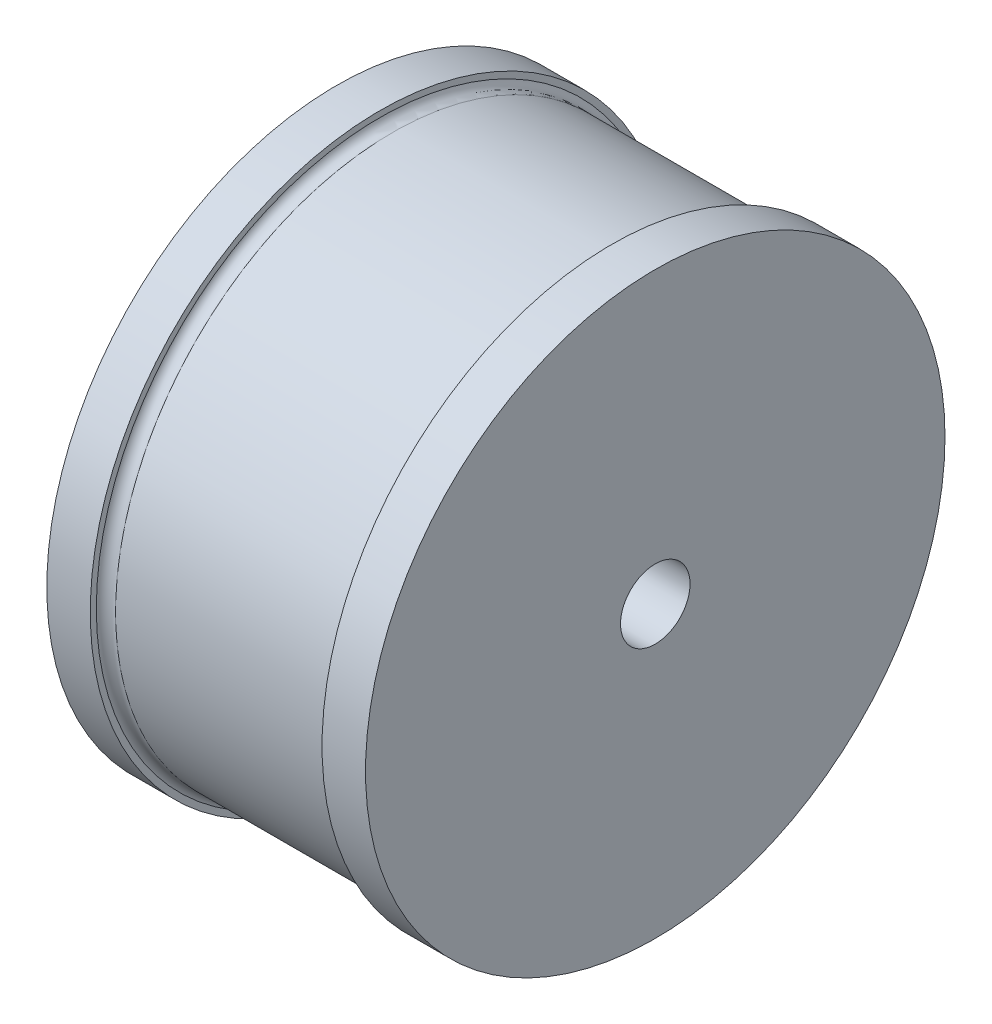
ISO-10303-21;
HEADER;
FILE_DESCRIPTION(('STEP AP214'),'2;1');
FILE_NAME('part.step','',(''),(''),'','','');
FILE_SCHEMA(('AUTOMOTIVE_DESIGN { 1 0 10303 214 1 1 1 1 }'));
ENDSEC;
DATA;
#1=APPLICATION_CONTEXT('core data for automotive mechanical design processes');
#2=APPLICATION_PROTOCOL_DEFINITION('international standard','automotive_design',2000,#1);
#3=PRODUCT_CONTEXT('',#1,'mechanical');
#4=PRODUCT('Part','Part','',(#3));
#5=PRODUCT_RELATED_PRODUCT_CATEGORY('part','',(#4));
#6=PRODUCT_DEFINITION_FORMATION('','',#4);
#7=PRODUCT_DEFINITION_CONTEXT('part definition',#1,'design');
#8=PRODUCT_DEFINITION('design','',#6,#7);
#9=PRODUCT_DEFINITION_SHAPE('','',#8);
#10=(LENGTH_UNIT() NAMED_UNIT(*) SI_UNIT(.MILLI.,.METRE.));
#11=(NAMED_UNIT(*) PLANE_ANGLE_UNIT() SI_UNIT($,.RADIAN.));
#12=(NAMED_UNIT(*) SI_UNIT($,.STERADIAN.) SOLID_ANGLE_UNIT());
#13=UNCERTAINTY_MEASURE_WITH_UNIT(LENGTH_MEASURE(1.E-05),#10,'distance_accuracy_value','');
#14=(GEOMETRIC_REPRESENTATION_CONTEXT(3) GLOBAL_UNCERTAINTY_ASSIGNED_CONTEXT((#13)) GLOBAL_UNIT_ASSIGNED_CONTEXT((#10,
#11,#12)) REPRESENTATION_CONTEXT('',''));
#15=CARTESIAN_POINT('',(0.,0.,0.));
#16=DIRECTION('',(0.,0.,1.));
#17=DIRECTION('',(1.,0.,0.));
#18=AXIS2_PLACEMENT_3D('',#15,#16,#17);
#19=CARTESIAN_POINT('',(23.8765002952672,28.5009217082499,0.));
#20=DIRECTION('',(1.,0.,0.));
#21=DIRECTION('',(0.,0.,-1.));
#22=AXIS2_PLACEMENT_3D('',#19,#20,#21);
#23=PLANE('',#22);
#24=CARTESIAN_POINT('',(23.8765002952672,-21.4990782917501,0.));
#25=DIRECTION('',(1.,0.,0.));
#26=DIRECTION('',(0.,0.,-1.));
#27=AXIS2_PLACEMENT_3D('',#24,#25,#26);
#28=CIRCLE('',#27,6.);
#29=CARTESIAN_POINT('',(23.8765002952672,-21.4990782917501,-6.));
#30=VERTEX_POINT('',#29);
#31=EDGE_CURVE('E66',#30,#30,#28,.T.);
#32=ORIENTED_EDGE('',*,*,#31,.F.);
#33=EDGE_LOOP('',(#32));
#34=FACE_BOUND('',#33,.T.);
#35=CARTESIAN_POINT('',(23.8765002952672,-21.4990782917501,0.));
#36=DIRECTION('',(1.,0.,0.));
#37=DIRECTION('',(0.,0.,-1.));
#38=AXIS2_PLACEMENT_3D('',#35,#36,#37);
#39=CIRCLE('',#38,50.);
#40=CARTESIAN_POINT('',(23.8765002952672,-21.4990782917501,-50.));
#41=VERTEX_POINT('',#40);
#42=EDGE_CURVE('E62',#41,#41,#39,.T.);
#43=ORIENTED_EDGE('',*,*,#42,.T.);
#44=EDGE_LOOP('',(#43));
#45=FACE_BOUND('',#44,.T.);
#46=ADVANCED_FACE('F34',(#34,#45),#23,.T.);
#47=CARTESIAN_POINT('',(-31.1234997047328,20.2265970360911,0.));
#48=DIRECTION('',(-1.,0.,0.));
#49=DIRECTION('',(0.,0.,1.));
#50=AXIS2_PLACEMENT_3D('',#47,#48,#49);
#51=PLANE('',#50);
#52=CARTESIAN_POINT('',(-31.1234997047328,-21.4990782917501,0.));
#53=DIRECTION('',(1.,0.,0.));
#54=DIRECTION('',(0.,0.,-1.));
#55=AXIS2_PLACEMENT_3D('',#52,#53,#54);
#56=CIRCLE('',#55,6.);
#57=CARTESIAN_POINT('',(-31.1234997047328,-21.4990782917501,-6.));
#58=VERTEX_POINT('',#57);
#59=EDGE_CURVE('E65',#58,#58,#56,.T.);
#60=ORIENTED_EDGE('',*,*,#59,.T.);
#61=EDGE_LOOP('',(#60));
#62=FACE_BOUND('',#61,.T.);
#63=CARTESIAN_POINT('',(-31.1234997047328,-21.4990782917501,0.));
#64=DIRECTION('',(1.,0.,0.));
#65=DIRECTION('',(0.,0.,-1.));
#66=AXIS2_PLACEMENT_3D('',#63,#64,#65);
#67=CIRCLE('',#66,50.);
#68=CARTESIAN_POINT('',(-31.1234997047328,-21.4990782917501,-50.));
#69=VERTEX_POINT('',#68);
#70=EDGE_CURVE('E10',#69,#69,#67,.T.);
#71=ORIENTED_EDGE('',*,*,#70,.F.);
#72=EDGE_LOOP('',(#71));
#73=FACE_BOUND('',#72,.T.);
#74=ADVANCED_FACE('F72',(#62,#73),#51,.T.);
#75=CARTESIAN_POINT('',(23.8765002952672,-21.4990782917501,0.));
#76=DIRECTION('',(1.,0.,0.));
#77=DIRECTION('',(0.,0.,-1.));
#78=AXIS2_PLACEMENT_3D('',#75,#76,#77);
#79=CYLINDRICAL_SURFACE('',#78,50.);
#80=ORIENTED_EDGE('',*,*,#70,.T.);
#81=EDGE_LOOP('',(#80));
#82=FACE_BOUND('',#81,.T.);
#83=CARTESIAN_POINT('',(-23.6234997047328,-21.4990782917501,0.));
#84=DIRECTION('',(1.,0.,0.));
#85=DIRECTION('',(0.,0.,-1.));
#86=AXIS2_PLACEMENT_3D('',#83,#84,#85);
#87=CIRCLE('',#86,50.);
#88=CARTESIAN_POINT('',(-23.6234997047328,-21.4990782917501,-50.));
#89=VERTEX_POINT('',#88);
#90=EDGE_CURVE('E40',#89,#89,#87,.T.);
#91=ORIENTED_EDGE('',*,*,#90,.F.);
#92=EDGE_LOOP('',(#91));
#93=FACE_BOUND('',#92,.T.);
#94=ADVANCED_FACE('F111',(#82,#93),#79,.T.);
#95=CARTESIAN_POINT('',(-23.6234997047328,28.5009217082499,0.));
#96=DIRECTION('',(1.,0.,0.));
#97=DIRECTION('',(0.,0.,-1.));
#98=AXIS2_PLACEMENT_3D('',#95,#96,#97);
#99=PLANE('',#98);
#100=ORIENTED_EDGE('',*,*,#90,.T.);
#101=EDGE_LOOP('',(#100));
#102=FACE_BOUND('',#101,.T.);
#103=CARTESIAN_POINT('',(-23.6234997047328,-21.4990782917501,0.));
#104=DIRECTION('',(1.,0.,0.));
#105=DIRECTION('',(0.,0.,-1.));
#106=AXIS2_PLACEMENT_3D('',#103,#104,#105);
#107=CIRCLE('',#106,48.9565128213629);
#108=CARTESIAN_POINT('',(-23.6234997047328,-21.4990782917501,-48.9565128213629));
#109=VERTEX_POINT('',#108);
#110=EDGE_CURVE('E44',#109,#109,#107,.T.);
#111=ORIENTED_EDGE('',*,*,#110,.F.);
#112=EDGE_LOOP('',(#111));
#113=FACE_BOUND('',#112,.T.);
#114=ADVANCED_FACE('F107',(#102,#113),#99,.T.);
#115=CARTESIAN_POINT('',(-21.9644267252277,-21.4990782917501,0.));
#116=DIRECTION('',(1.,0.,0.));
#117=DIRECTION('',(0.,0.,-1.));
#118=AXIS2_PLACEMENT_3D('',#115,#116,#117);
#119=TOROIDAL_SURFACE('',#118,49.4590729795052,1.73351950201775);
#120=ORIENTED_EDGE('',*,*,#110,.T.);
#121=EDGE_LOOP('',(#120));
#122=FACE_BOUND('',#121,.T.);
#123=CARTESIAN_POINT('',(-21.4618665670857,-21.4990782917501,0.));
#124=DIRECTION('',(1.,0.,0.));
#125=DIRECTION('',(0.,0.,-1.));
#126=AXIS2_PLACEMENT_3D('',#123,#124,#125);
#127=CIRCLE('',#126,47.8);
#128=CARTESIAN_POINT('',(-21.4618665670857,-21.4990782917501,-47.8));
#129=VERTEX_POINT('',#128);
#130=EDGE_CURVE('E48',#129,#129,#127,.T.);
#131=ORIENTED_EDGE('',*,*,#130,.F.);
#132=EDGE_LOOP('',(#131));
#133=FACE_BOUND('',#132,.T.);
#134=ADVANCED_FACE('F103',(#122,#133),#119,.F.);
#135=CARTESIAN_POINT('',(23.8765002952672,-21.4990782917501,0.));
#136=DIRECTION('',(1.,0.,0.));
#137=DIRECTION('',(0.,0.,-1.));
#138=AXIS2_PLACEMENT_3D('',#135,#136,#137);
#139=CYLINDRICAL_SURFACE('',#138,47.8);
#140=ORIENTED_EDGE('',*,*,#130,.T.);
#141=EDGE_LOOP('',(#140));
#142=FACE_BOUND('',#141,.T.);
#143=CARTESIAN_POINT('',(14.8143680710811,-21.4990782917501,0.));
#144=DIRECTION('',(1.,0.,0.));
#145=DIRECTION('',(0.,0.,-1.));
#146=AXIS2_PLACEMENT_3D('',#143,#144,#145);
#147=CIRCLE('',#146,47.8);
#148=CARTESIAN_POINT('',(14.8143680710811,-21.4990782917501,-47.8));
#149=VERTEX_POINT('',#148);
#150=EDGE_CURVE('E53',#149,#149,#147,.T.);
#151=ORIENTED_EDGE('',*,*,#150,.F.);
#152=EDGE_LOOP('',(#151));
#153=FACE_BOUND('',#152,.T.);
#154=ADVANCED_FACE('F99',(#142,#153),#139,.T.);
#155=CARTESIAN_POINT('',(14.7658446435271,-21.4990782917501,0.));
#156=DIRECTION('',(1.,0.,0.));
#157=DIRECTION('',(0.,0.,-1.));
#158=AXIS2_PLACEMENT_3D('',#155,#156,#157);
#159=TOROIDAL_SURFACE('',#158,49.4993073521228,1.7);
#160=ORIENTED_EDGE('',*,*,#150,.T.);
#161=EDGE_LOOP('',(#160));
#162=FACE_BOUND('',#161,.T.);
#163=CARTESIAN_POINT('',(16.3765002952672,-21.4990782917501,0.));
#164=DIRECTION('',(1.,0.,0.));
#165=DIRECTION('',(0.,0.,-1.));
#166=AXIS2_PLACEMENT_3D('',#163,#164,#165);
#167=CIRCLE('',#166,48.9554430569925);
#168=CARTESIAN_POINT('',(16.3765002952672,-21.4990782917501,-48.9554430569925));
#169=VERTEX_POINT('',#168);
#170=EDGE_CURVE('E56',#169,#169,#167,.T.);
#171=ORIENTED_EDGE('',*,*,#170,.F.);
#172=EDGE_LOOP('',(#171));
#173=FACE_BOUND('',#172,.T.);
#174=ADVANCED_FACE('F93',(#162,#173),#159,.F.);
#175=CARTESIAN_POINT('',(16.3765002952672,28.5009217082499,0.));
#176=DIRECTION('',(-1.,0.,0.));
#177=DIRECTION('',(0.,0.,1.));
#178=AXIS2_PLACEMENT_3D('',#175,#176,#177);
#179=PLANE('',#178);
#180=ORIENTED_EDGE('',*,*,#170,.T.);
#181=EDGE_LOOP('',(#180));
#182=FACE_BOUND('',#181,.T.);
#183=CARTESIAN_POINT('',(16.3765002952672,-21.4990782917501,0.));
#184=DIRECTION('',(1.,0.,0.));
#185=DIRECTION('',(0.,0.,-1.));
#186=AXIS2_PLACEMENT_3D('',#183,#184,#185);
#187=CIRCLE('',#186,50.);
#188=CARTESIAN_POINT('',(16.3765002952672,-21.4990782917501,-50.));
#189=VERTEX_POINT('',#188);
#190=EDGE_CURVE('E59',#189,#189,#187,.T.);
#191=ORIENTED_EDGE('',*,*,#190,.F.);
#192=EDGE_LOOP('',(#191));
#193=FACE_BOUND('',#192,.T.);
#194=ADVANCED_FACE('F87',(#182,#193),#179,.T.);
#195=CARTESIAN_POINT('',(23.8765002952672,-21.4990782917501,0.));
#196=DIRECTION('',(1.,0.,0.));
#197=DIRECTION('',(0.,0.,-1.));
#198=AXIS2_PLACEMENT_3D('',#195,#196,#197);
#199=CYLINDRICAL_SURFACE('',#198,50.);
#200=ORIENTED_EDGE('',*,*,#190,.T.);
#201=EDGE_LOOP('',(#200));
#202=FACE_BOUND('',#201,.T.);
#203=ORIENTED_EDGE('',*,*,#42,.F.);
#204=EDGE_LOOP('',(#203));
#205=FACE_BOUND('',#204,.T.);
#206=ADVANCED_FACE('F78',(#202,#205),#199,.T.);
#207=CARTESIAN_POINT('',(-31.1234997047328,-21.4990782917501,0.));
#208=DIRECTION('',(1.,0.,0.));
#209=DIRECTION('',(0.,0.,-1.));
#210=AXIS2_PLACEMENT_3D('',#207,#208,#209);
#211=CYLINDRICAL_SURFACE('',#210,6.);
#212=ORIENTED_EDGE('',*,*,#59,.F.);
#213=EDGE_LOOP('',(#212));
#214=FACE_BOUND('',#213,.T.);
#215=ORIENTED_EDGE('',*,*,#31,.T.);
#216=EDGE_LOOP('',(#215));
#217=FACE_BOUND('',#216,.T.);
#218=ADVANCED_FACE('F75',(#214,#217),#211,.F.);
#219=CLOSED_SHELL('',(#46,#74,#94,#114,#134,#154,#174,#194,#206,#218));
#220=MANIFOLD_SOLID_BREP('B2',#219);
#221=ADVANCED_BREP_SHAPE_REPRESENTATION('',(#18,#220),#14);
#222=SHAPE_DEFINITION_REPRESENTATION(#9,#221);
ENDSEC;
END-ISO-10303-21;
